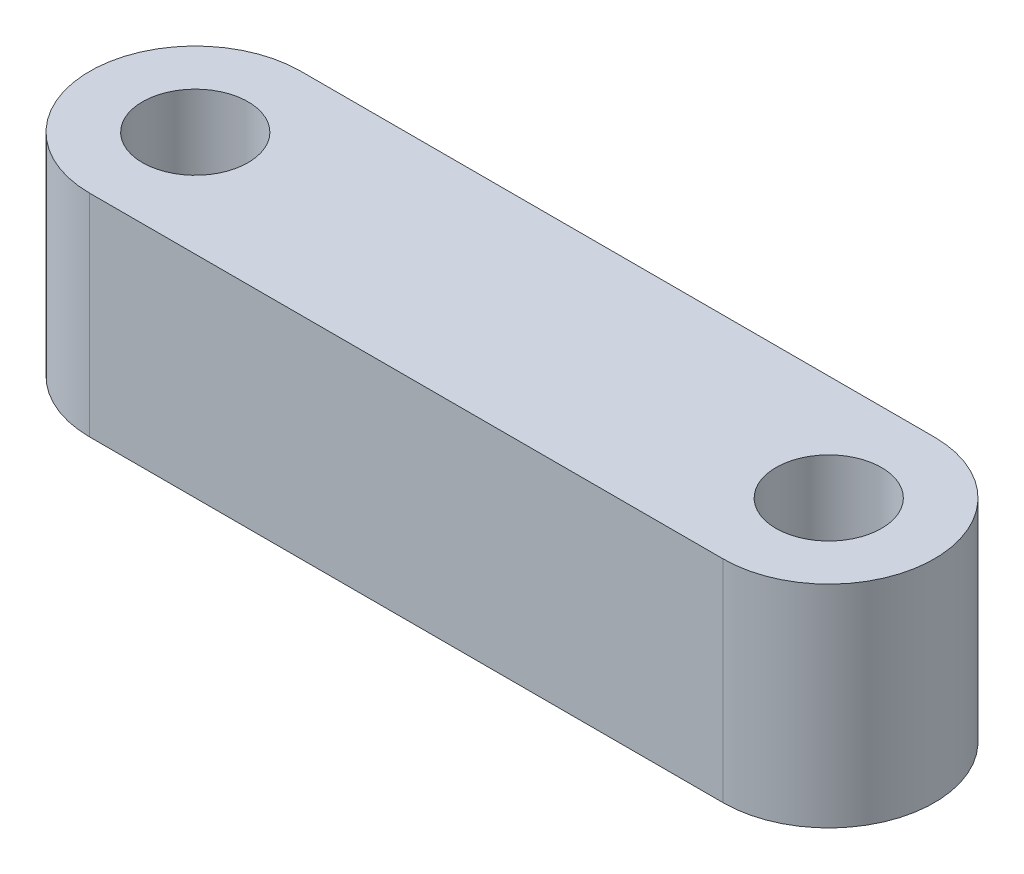
ISO-10303-21;
HEADER;
FILE_DESCRIPTION(('STEP AP214'),'2;1');
FILE_NAME('part.step','',(''),(''),'','','');
FILE_SCHEMA(('AUTOMOTIVE_DESIGN { 1 0 10303 214 1 1 1 1 }'));
ENDSEC;
DATA;
#1=APPLICATION_CONTEXT('core data for automotive mechanical design processes');
#2=APPLICATION_PROTOCOL_DEFINITION('international standard','automotive_design',2000,#1);
#3=PRODUCT_CONTEXT('',#1,'mechanical');
#4=PRODUCT('Part','Part','',(#3));
#5=PRODUCT_RELATED_PRODUCT_CATEGORY('part','',(#4));
#6=PRODUCT_DEFINITION_FORMATION('','',#4);
#7=PRODUCT_DEFINITION_CONTEXT('part definition',#1,'design');
#8=PRODUCT_DEFINITION('design','',#6,#7);
#9=PRODUCT_DEFINITION_SHAPE('','',#8);
#10=(LENGTH_UNIT() NAMED_UNIT(*) SI_UNIT(.MILLI.,.METRE.));
#11=(NAMED_UNIT(*) PLANE_ANGLE_UNIT() SI_UNIT($,.RADIAN.));
#12=(NAMED_UNIT(*) SI_UNIT($,.STERADIAN.) SOLID_ANGLE_UNIT());
#13=UNCERTAINTY_MEASURE_WITH_UNIT(LENGTH_MEASURE(1.E-05),#10,'distance_accuracy_value','');
#14=(GEOMETRIC_REPRESENTATION_CONTEXT(3) GLOBAL_UNCERTAINTY_ASSIGNED_CONTEXT((#13)) GLOBAL_UNIT_ASSIGNED_CONTEXT((#10,
#11,#12)) REPRESENTATION_CONTEXT('',''));
#15=CARTESIAN_POINT('',(0.,0.,0.));
#16=DIRECTION('',(0.,0.,1.));
#17=DIRECTION('',(1.,0.,0.));
#18=AXIS2_PLACEMENT_3D('',#15,#16,#17);
#19=CARTESIAN_POINT('',(-15.,10.,0.));
#20=DIRECTION('',(0.,1.,0.));
#21=DIRECTION('',(0.,0.,1.));
#22=AXIS2_PLACEMENT_3D('',#19,#20,#21);
#23=PLANE('',#22);
#24=CARTESIAN_POINT('',(-15.,10.,0.));
#25=DIRECTION('',(0.,1.,0.));
#26=DIRECTION('',(0.,0.,1.));
#27=AXIS2_PLACEMENT_3D('',#24,#25,#26);
#28=CIRCLE('',#27,2.5);
#29=CARTESIAN_POINT('',(-15.,10.,2.5));
#30=VERTEX_POINT('',#29);
#31=EDGE_CURVE('E100',#30,#30,#28,.T.);
#32=ORIENTED_EDGE('',*,*,#31,.F.);
#33=EDGE_LOOP('',(#32));
#34=FACE_BOUND('',#33,.T.);
#35=CARTESIAN_POINT('',(-15.,10.,0.));
#36=DIRECTION('',(0.,1.,0.));
#37=DIRECTION('',(0.,0.,1.));
#38=AXIS2_PLACEMENT_3D('',#35,#36,#37);
#39=CIRCLE('',#38,5.);
#40=CARTESIAN_POINT('',(-15.,10.,-5.));
#41=VERTEX_POINT('',#40);
#42=CARTESIAN_POINT('',(-15.,10.,5.));
#43=VERTEX_POINT('',#42);
#44=EDGE_CURVE('E85',#41,#43,#39,.T.);
#45=ORIENTED_EDGE('',*,*,#44,.T.);
#46=DIRECTION('',(1.,0.,0.));
#47=VECTOR('',#46,1.);
#48=CARTESIAN_POINT('',(-15.,10.,5.));
#49=LINE('',#48,#47);
#50=CARTESIAN_POINT('',(15.,10.,5.));
#51=VERTEX_POINT('',#50);
#52=EDGE_CURVE('E80',#43,#51,#49,.T.);
#53=ORIENTED_EDGE('',*,*,#52,.T.);
#54=CARTESIAN_POINT('',(15.,10.,0.));
#55=DIRECTION('',(0.,1.,0.));
#56=DIRECTION('',(0.,0.,1.));
#57=AXIS2_PLACEMENT_3D('',#54,#55,#56);
#58=CIRCLE('',#57,5.);
#59=CARTESIAN_POINT('',(15.,10.,-5.));
#60=VERTEX_POINT('',#59);
#61=EDGE_CURVE('E83',#51,#60,#58,.T.);
#62=ORIENTED_EDGE('',*,*,#61,.T.);
#63=DIRECTION('',(-1.,0.,0.));
#64=VECTOR('',#63,1.);
#65=CARTESIAN_POINT('',(-15.,10.,-5.));
#66=LINE('',#65,#64);
#67=EDGE_CURVE('E50',#60,#41,#66,.T.);
#68=ORIENTED_EDGE('',*,*,#67,.T.);
#69=EDGE_LOOP('',(#45,#53,#62,#68));
#70=FACE_BOUND('',#69,.T.);
#71=CARTESIAN_POINT('',(15.,10.,0.));
#72=DIRECTION('',(0.,1.,0.));
#73=DIRECTION('',(0.,0.,1.));
#74=AXIS2_PLACEMENT_3D('',#71,#72,#73);
#75=CIRCLE('',#74,2.5);
#76=CARTESIAN_POINT('',(15.,10.,2.5));
#77=VERTEX_POINT('',#76);
#78=EDGE_CURVE('E115',#77,#77,#75,.T.);
#79=ORIENTED_EDGE('',*,*,#78,.F.);
#80=EDGE_LOOP('',(#79));
#81=FACE_BOUND('',#80,.T.);
#82=ADVANCED_FACE('F33',(#34,#70,#81),#23,.T.);
#83=CARTESIAN_POINT('',(-15.,0.,0.));
#84=DIRECTION('',(0.,1.,0.));
#85=DIRECTION('',(0.,0.,1.));
#86=AXIS2_PLACEMENT_3D('',#83,#84,#85);
#87=PLANE('',#86);
#88=CARTESIAN_POINT('',(-15.,0.,0.));
#89=DIRECTION('',(0.,1.,0.));
#90=DIRECTION('',(0.,0.,1.));
#91=AXIS2_PLACEMENT_3D('',#88,#89,#90);
#92=CIRCLE('',#91,5.);
#93=CARTESIAN_POINT('',(-15.,0.,-5.));
#94=VERTEX_POINT('',#93);
#95=CARTESIAN_POINT('',(-15.,0.,5.));
#96=VERTEX_POINT('',#95);
#97=EDGE_CURVE('E97',#94,#96,#92,.T.);
#98=ORIENTED_EDGE('',*,*,#97,.F.);
#99=DIRECTION('',(-1.,0.,0.));
#100=VECTOR('',#99,1.);
#101=CARTESIAN_POINT('',(-15.,0.,-5.));
#102=LINE('',#101,#100);
#103=CARTESIAN_POINT('',(15.,0.,-5.));
#104=VERTEX_POINT('',#103);
#105=EDGE_CURVE('E73',#104,#94,#102,.T.);
#106=ORIENTED_EDGE('',*,*,#105,.F.);
#107=CARTESIAN_POINT('',(15.,0.,0.));
#108=DIRECTION('',(0.,1.,0.));
#109=DIRECTION('',(0.,0.,1.));
#110=AXIS2_PLACEMENT_3D('',#107,#108,#109);
#111=CIRCLE('',#110,5.);
#112=CARTESIAN_POINT('',(15.,0.,5.));
#113=VERTEX_POINT('',#112);
#114=EDGE_CURVE('E67',#113,#104,#111,.T.);
#115=ORIENTED_EDGE('',*,*,#114,.F.);
#116=DIRECTION('',(1.,0.,0.));
#117=VECTOR('',#116,1.);
#118=CARTESIAN_POINT('',(-15.,0.,5.));
#119=LINE('',#118,#117);
#120=EDGE_CURVE('E89',#96,#113,#119,.T.);
#121=ORIENTED_EDGE('',*,*,#120,.F.);
#122=EDGE_LOOP('',(#98,#106,#115,#121));
#123=FACE_BOUND('',#122,.T.);
#124=CARTESIAN_POINT('',(-15.,0.,0.));
#125=DIRECTION('',(0.,1.,0.));
#126=DIRECTION('',(0.,0.,1.));
#127=AXIS2_PLACEMENT_3D('',#124,#125,#126);
#128=CIRCLE('',#127,2.5);
#129=CARTESIAN_POINT('',(-15.,0.,2.5));
#130=VERTEX_POINT('',#129);
#131=EDGE_CURVE('E112',#130,#130,#128,.T.);
#132=ORIENTED_EDGE('',*,*,#131,.T.);
#133=EDGE_LOOP('',(#132));
#134=FACE_BOUND('',#133,.T.);
#135=CARTESIAN_POINT('',(15.,0.,0.));
#136=DIRECTION('',(0.,1.,0.));
#137=DIRECTION('',(0.,0.,1.));
#138=AXIS2_PLACEMENT_3D('',#135,#136,#137);
#139=CIRCLE('',#138,2.5);
#140=CARTESIAN_POINT('',(15.,0.,2.5));
#141=VERTEX_POINT('',#140);
#142=EDGE_CURVE('E118',#141,#141,#139,.T.);
#143=ORIENTED_EDGE('',*,*,#142,.T.);
#144=EDGE_LOOP('',(#143));
#145=FACE_BOUND('',#144,.T.);
#146=ADVANCED_FACE('F108',(#123,#134,#145),#87,.F.);
#147=CARTESIAN_POINT('',(-15.,10.,0.));
#148=DIRECTION('',(0.,-1.,0.));
#149=DIRECTION('',(0.,0.,-1.));
#150=AXIS2_PLACEMENT_3D('',#147,#148,#149);
#151=CYLINDRICAL_SURFACE('',#150,5.);
#152=ORIENTED_EDGE('',*,*,#97,.T.);
#153=DIRECTION('',(0.,-1.,0.));
#154=VECTOR('',#153,1.);
#155=CARTESIAN_POINT('',(-15.,10.,5.));
#156=LINE('',#155,#154);
#157=EDGE_CURVE('E11',#43,#96,#156,.T.);
#158=ORIENTED_EDGE('',*,*,#157,.F.);
#159=ORIENTED_EDGE('',*,*,#44,.F.);
#160=DIRECTION('',(0.,-1.,0.));
#161=VECTOR('',#160,1.);
#162=CARTESIAN_POINT('',(-15.,10.,-5.));
#163=LINE('',#162,#161);
#164=EDGE_CURVE('E93',#41,#94,#163,.T.);
#165=ORIENTED_EDGE('',*,*,#164,.T.);
#166=EDGE_LOOP('',(#152,#158,#159,#165));
#167=FACE_BOUND('',#166,.T.);
#168=ADVANCED_FACE('F35',(#167),#151,.T.);
#169=CARTESIAN_POINT('',(-15.,10.,5.));
#170=DIRECTION('',(0.,0.,-1.));
#171=DIRECTION('',(-1.,0.,0.));
#172=AXIS2_PLACEMENT_3D('',#169,#170,#171);
#173=PLANE('',#172);
#174=ORIENTED_EDGE('',*,*,#120,.T.);
#175=DIRECTION('',(0.,-1.,0.));
#176=VECTOR('',#175,1.);
#177=CARTESIAN_POINT('',(15.,10.,5.));
#178=LINE('',#177,#176);
#179=EDGE_CURVE('E42',#51,#113,#178,.T.);
#180=ORIENTED_EDGE('',*,*,#179,.F.);
#181=ORIENTED_EDGE('',*,*,#52,.F.);
#182=ORIENTED_EDGE('',*,*,#157,.T.);
#183=EDGE_LOOP('',(#174,#180,#181,#182));
#184=FACE_BOUND('',#183,.T.);
#185=ADVANCED_FACE('F88',(#184),#173,.F.);
#186=CARTESIAN_POINT('',(15.,10.,0.));
#187=DIRECTION('',(0.,-1.,0.));
#188=DIRECTION('',(0.,0.,-1.));
#189=AXIS2_PLACEMENT_3D('',#186,#187,#188);
#190=CYLINDRICAL_SURFACE('',#189,5.);
#191=ORIENTED_EDGE('',*,*,#114,.T.);
#192=DIRECTION('',(0.,-1.,0.));
#193=VECTOR('',#192,1.);
#194=CARTESIAN_POINT('',(15.,10.,-5.));
#195=LINE('',#194,#193);
#196=EDGE_CURVE('E90',#60,#104,#195,.T.);
#197=ORIENTED_EDGE('',*,*,#196,.F.);
#198=ORIENTED_EDGE('',*,*,#61,.F.);
#199=ORIENTED_EDGE('',*,*,#179,.T.);
#200=EDGE_LOOP('',(#191,#197,#198,#199));
#201=FACE_BOUND('',#200,.T.);
#202=ADVANCED_FACE('F91',(#201),#190,.T.);
#203=CARTESIAN_POINT('',(-15.,10.,-5.));
#204=DIRECTION('',(0.,0.,1.));
#205=DIRECTION('',(1.,0.,0.));
#206=AXIS2_PLACEMENT_3D('',#203,#204,#205);
#207=PLANE('',#206);
#208=ORIENTED_EDGE('',*,*,#105,.T.);
#209=ORIENTED_EDGE('',*,*,#164,.F.);
#210=ORIENTED_EDGE('',*,*,#67,.F.);
#211=ORIENTED_EDGE('',*,*,#196,.T.);
#212=EDGE_LOOP('',(#208,#209,#210,#211));
#213=FACE_BOUND('',#212,.T.);
#214=ADVANCED_FACE('F105',(#213),#207,.F.);
#215=CARTESIAN_POINT('',(-15.,10.,0.));
#216=DIRECTION('',(0.,-1.,0.));
#217=DIRECTION('',(0.,0.,-1.));
#218=AXIS2_PLACEMENT_3D('',#215,#216,#217);
#219=CYLINDRICAL_SURFACE('',#218,2.5);
#220=ORIENTED_EDGE('',*,*,#31,.T.);
#221=EDGE_LOOP('',(#220));
#222=FACE_BOUND('',#221,.T.);
#223=ORIENTED_EDGE('',*,*,#131,.F.);
#224=EDGE_LOOP('',(#223));
#225=FACE_BOUND('',#224,.T.);
#226=ADVANCED_FACE('F135',(#222,#225),#219,.F.);
#227=CARTESIAN_POINT('',(15.,10.,0.));
#228=DIRECTION('',(0.,-1.,0.));
#229=DIRECTION('',(0.,0.,-1.));
#230=AXIS2_PLACEMENT_3D('',#227,#228,#229);
#231=CYLINDRICAL_SURFACE('',#230,2.5);
#232=ORIENTED_EDGE('',*,*,#78,.T.);
#233=EDGE_LOOP('',(#232));
#234=FACE_BOUND('',#233,.T.);
#235=ORIENTED_EDGE('',*,*,#142,.F.);
#236=EDGE_LOOP('',(#235));
#237=FACE_BOUND('',#236,.T.);
#238=ADVANCED_FACE('F124',(#234,#237),#231,.F.);
#239=CLOSED_SHELL('',(#82,#146,#168,#185,#202,#214,#226,#238));
#240=MANIFOLD_SOLID_BREP('B2',#239);
#241=ADVANCED_BREP_SHAPE_REPRESENTATION('',(#18,#240),#14);
#242=SHAPE_DEFINITION_REPRESENTATION(#9,#241);
ENDSEC;
END-ISO-10303-21;
